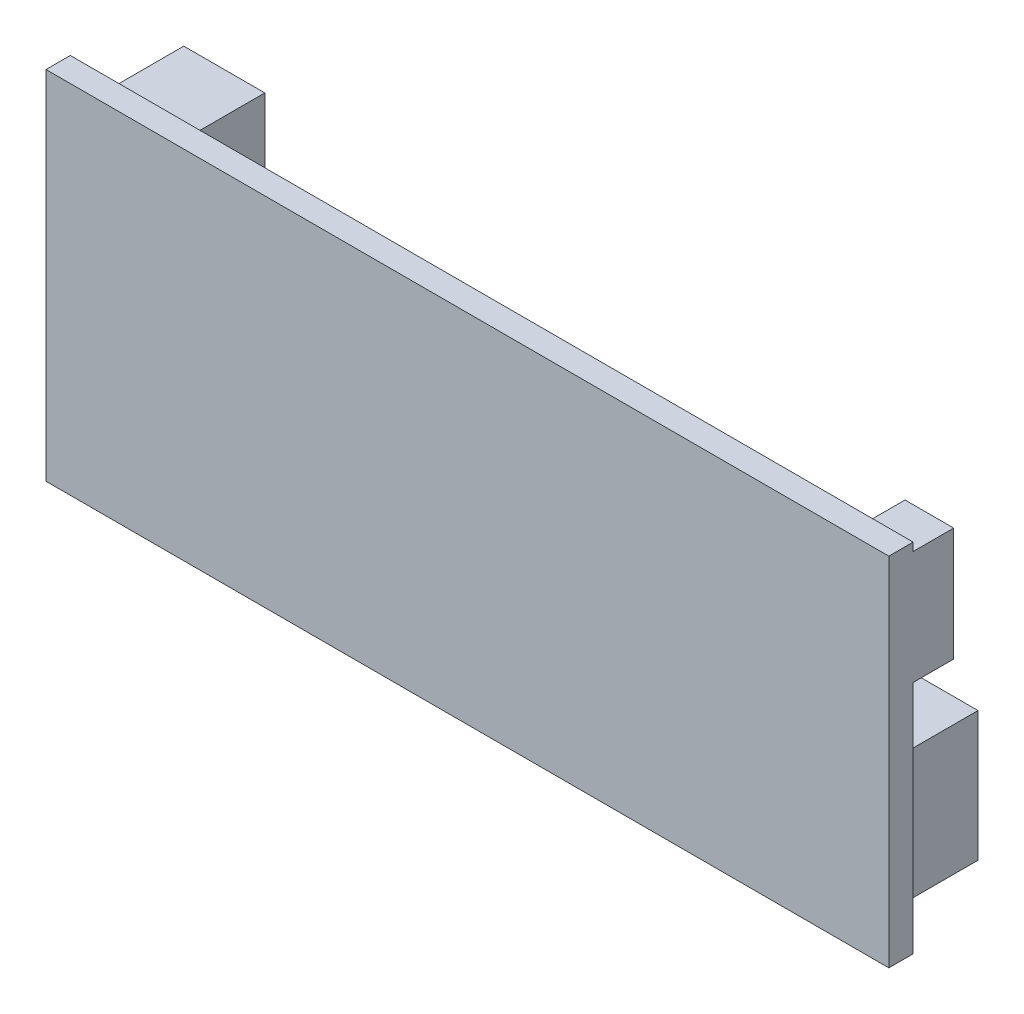
ISO-10303-21;
HEADER;
FILE_DESCRIPTION(('STEP AP214'),'2;1');
FILE_NAME('part.step','',(''),(''),'','','');
FILE_SCHEMA(('AUTOMOTIVE_DESIGN { 1 0 10303 214 1 1 1 1 }'));
ENDSEC;
DATA;
#1=APPLICATION_CONTEXT('core data for automotive mechanical design processes');
#2=APPLICATION_PROTOCOL_DEFINITION('international standard','automotive_design',2000,#1);
#3=PRODUCT_CONTEXT('',#1,'mechanical');
#4=PRODUCT('Part','Part','',(#3));
#5=PRODUCT_RELATED_PRODUCT_CATEGORY('part','',(#4));
#6=PRODUCT_DEFINITION_FORMATION('','',#4);
#7=PRODUCT_DEFINITION_CONTEXT('part definition',#1,'design');
#8=PRODUCT_DEFINITION('design','',#6,#7);
#9=PRODUCT_DEFINITION_SHAPE('','',#8);
#10=(LENGTH_UNIT() NAMED_UNIT(*) SI_UNIT(.MILLI.,.METRE.));
#11=(NAMED_UNIT(*) PLANE_ANGLE_UNIT() SI_UNIT($,.RADIAN.));
#12=(NAMED_UNIT(*) SI_UNIT($,.STERADIAN.) SOLID_ANGLE_UNIT());
#13=UNCERTAINTY_MEASURE_WITH_UNIT(LENGTH_MEASURE(1.E-05),#10,'distance_accuracy_value','');
#14=(GEOMETRIC_REPRESENTATION_CONTEXT(3) GLOBAL_UNCERTAINTY_ASSIGNED_CONTEXT((#13)) GLOBAL_UNIT_ASSIGNED_CONTEXT((#10,
#11,#12)) REPRESENTATION_CONTEXT('',''));
#15=CARTESIAN_POINT('',(0.,0.,0.));
#16=DIRECTION('',(0.,0.,1.));
#17=DIRECTION('',(1.,0.,0.));
#18=AXIS2_PLACEMENT_3D('',#15,#16,#17);
#19=CARTESIAN_POINT('',(0.,0.,0.));
#20=DIRECTION('',(0.,0.,1.));
#21=DIRECTION('',(1.,0.,0.));
#22=AXIS2_PLACEMENT_3D('',#19,#20,#21);
#23=PLANE('',#22);
#24=DIRECTION('',(0.,1.,0.));
#25=VECTOR('',#24,1.);
#26=CARTESIAN_POINT('',(-17.781512605042,20.5,0.));
#27=LINE('',#26,#25);
#28=CARTESIAN_POINT('',(-17.781512605042,15.5,0.));
#29=VERTEX_POINT('',#28);
#30=CARTESIAN_POINT('',(-17.781512605042,20.5,0.));
#31=VERTEX_POINT('',#30);
#32=EDGE_CURVE('E288',#29,#31,#27,.T.);
#33=ORIENTED_EDGE('',*,*,#32,.F.);
#34=DIRECTION('',(-1.,0.,0.));
#35=VECTOR('',#34,1.);
#36=CARTESIAN_POINT('',(-17.781512605042,15.5,0.));
#37=LINE('',#36,#35);
#38=CARTESIAN_POINT('',(-12.781512605042,15.5,0.));
#39=VERTEX_POINT('',#38);
#40=EDGE_CURVE('E178',#39,#29,#37,.T.);
#41=ORIENTED_EDGE('',*,*,#40,.F.);
#42=DIRECTION('',(0.,-1.,0.));
#43=VECTOR('',#42,1.);
#44=CARTESIAN_POINT('',(-12.781512605042,20.5,0.));
#45=LINE('',#44,#43);
#46=CARTESIAN_POINT('',(-12.781512605042,20.5,0.));
#47=VERTEX_POINT('',#46);
#48=EDGE_CURVE('E293',#47,#39,#45,.T.);
#49=ORIENTED_EDGE('',*,*,#48,.F.);
#50=DIRECTION('',(1.,0.,0.));
#51=VECTOR('',#50,1.);
#52=CARTESIAN_POINT('',(-17.781512605042,20.5,0.));
#53=LINE('',#52,#51);
#54=EDGE_CURVE('E290',#31,#47,#53,.T.);
#55=ORIENTED_EDGE('',*,*,#54,.F.);
#56=EDGE_LOOP('',(#33,#41,#49,#55));
#57=FACE_BOUND('',#56,.T.);
#58=DIRECTION('',(0.,-1.,0.));
#59=VECTOR('',#58,1.);
#60=CARTESIAN_POINT('',(31.218487394958,1.5,0.));
#61=LINE('',#60,#59);
#62=CARTESIAN_POINT('',(31.218487394958,9.5,0.));
#63=VERTEX_POINT('',#62);
#64=CARTESIAN_POINT('',(31.218487394958,1.5,0.));
#65=VERTEX_POINT('',#64);
#66=EDGE_CURVE('E264',#63,#65,#61,.T.);
#67=ORIENTED_EDGE('',*,*,#66,.F.);
#68=DIRECTION('',(1.,0.,0.));
#69=VECTOR('',#68,1.);
#70=CARTESIAN_POINT('',(31.218487394958,9.5,0.));
#71=LINE('',#70,#69);
#72=CARTESIAN_POINT('',(21.218487394958,9.5,0.));
#73=VERTEX_POINT('',#72);
#74=EDGE_CURVE('E273',#73,#63,#71,.T.);
#75=ORIENTED_EDGE('',*,*,#74,.F.);
#76=DIRECTION('',(0.,1.,0.));
#77=VECTOR('',#76,1.);
#78=CARTESIAN_POINT('',(21.218487394958,1.5,0.));
#79=LINE('',#78,#77);
#80=CARTESIAN_POINT('',(21.218487394958,1.5,0.));
#81=VERTEX_POINT('',#80);
#82=EDGE_CURVE('E270',#81,#73,#79,.T.);
#83=ORIENTED_EDGE('',*,*,#82,.F.);
#84=DIRECTION('',(-1.,0.,0.));
#85=VECTOR('',#84,1.);
#86=CARTESIAN_POINT('',(31.218487394958,1.5,0.));
#87=LINE('',#86,#85);
#88=EDGE_CURVE('E267',#65,#81,#87,.T.);
#89=ORIENTED_EDGE('',*,*,#88,.F.);
#90=EDGE_LOOP('',(#67,#75,#83,#89));
#91=FACE_BOUND('',#90,.T.);
#92=DIRECTION('',(-1.,0.,0.));
#93=VECTOR('',#92,1.);
#94=CARTESIAN_POINT('',(-17.781512605042,3.09786204051446,0.));
#95=LINE('',#94,#93);
#96=CARTESIAN_POINT('',(-17.781512605042,3.09786204051446,0.));
#97=VERTEX_POINT('',#96);
#98=CARTESIAN_POINT('',(-19.281512605042,3.09786204051446,0.));
#99=VERTEX_POINT('',#98);
#100=EDGE_CURVE('E228',#97,#99,#95,.T.);
#101=ORIENTED_EDGE('',*,*,#100,.F.);
#102=DIRECTION('',(0.,-1.,0.));
#103=VECTOR('',#102,1.);
#104=CARTESIAN_POINT('',(-17.781512605042,7.9,0.));
#105=LINE('',#104,#103);
#106=CARTESIAN_POINT('',(-17.781512605042,7.9,0.));
#107=VERTEX_POINT('',#106);
#108=EDGE_CURVE('E225',#107,#97,#105,.T.);
#109=ORIENTED_EDGE('',*,*,#108,.F.);
#110=DIRECTION('',(1.,0.,0.));
#111=VECTOR('',#110,1.);
#112=CARTESIAN_POINT('',(-17.781512605042,7.9,0.));
#113=LINE('',#112,#111);
#114=CARTESIAN_POINT('',(-19.281512605042,7.9,0.));
#115=VERTEX_POINT('',#114);
#116=EDGE_CURVE('E230',#115,#107,#113,.T.);
#117=ORIENTED_EDGE('',*,*,#116,.F.);
#118=DIRECTION('',(0.,-1.,0.));
#119=VECTOR('',#118,1.);
#120=CARTESIAN_POINT('',(-19.281512605042,22.,0.));
#121=LINE('',#120,#119);
#122=CARTESIAN_POINT('',(-19.281512605042,22.,0.));
#123=VERTEX_POINT('',#122);
#124=EDGE_CURVE('E317',#123,#115,#121,.T.);
#125=ORIENTED_EDGE('',*,*,#124,.F.);
#126=DIRECTION('',(-1.,0.,0.));
#127=VECTOR('',#126,1.);
#128=CARTESIAN_POINT('',(32.718487394958,22.,0.));
#129=LINE('',#128,#127);
#130=CARTESIAN_POINT('',(32.718487394958,22.,0.));
#131=VERTEX_POINT('',#130);
#132=EDGE_CURVE('E302',#131,#123,#129,.T.);
#133=ORIENTED_EDGE('',*,*,#132,.F.);
#134=DIRECTION('',(0.,1.,0.));
#135=VECTOR('',#134,1.);
#136=CARTESIAN_POINT('',(32.718487394958,0.,0.));
#137=LINE('',#136,#135);
#138=CARTESIAN_POINT('',(32.718487394958,21.5,0.));
#139=VERTEX_POINT('',#138);
#140=EDGE_CURVE('E322',#139,#131,#137,.T.);
#141=ORIENTED_EDGE('',*,*,#140,.F.);
#142=DIRECTION('',(1.,0.,0.));
#143=VECTOR('',#142,1.);
#144=CARTESIAN_POINT('',(32.718487394958,21.5,0.));
#145=LINE('',#144,#143);
#146=CARTESIAN_POINT('',(29.718487394958,21.5,0.));
#147=VERTEX_POINT('',#146);
#148=EDGE_CURVE('E245',#147,#139,#145,.T.);
#149=ORIENTED_EDGE('',*,*,#148,.F.);
#150=DIRECTION('',(0.,1.,0.));
#151=VECTOR('',#150,1.);
#152=CARTESIAN_POINT('',(29.718487394958,21.5,0.));
#153=LINE('',#152,#151);
#154=CARTESIAN_POINT('',(29.718487394958,14.5,0.));
#155=VERTEX_POINT('',#154);
#156=EDGE_CURVE('E252',#155,#147,#153,.T.);
#157=ORIENTED_EDGE('',*,*,#156,.F.);
#158=DIRECTION('',(-1.,0.,0.));
#159=VECTOR('',#158,1.);
#160=CARTESIAN_POINT('',(32.718487394958,14.5,0.));
#161=LINE('',#160,#159);
#162=CARTESIAN_POINT('',(32.718487394958,14.5,0.));
#163=VERTEX_POINT('',#162);
#164=EDGE_CURVE('E240',#163,#155,#161,.T.);
#165=ORIENTED_EDGE('',*,*,#164,.F.);
#166=CARTESIAN_POINT('',(32.718487394958,0.,0.));
#167=VERTEX_POINT('',#166);
#168=EDGE_CURVE('E307',#167,#163,#137,.T.);
#169=ORIENTED_EDGE('',*,*,#168,.F.);
#170=DIRECTION('',(1.,0.,0.));
#171=VECTOR('',#170,1.);
#172=CARTESIAN_POINT('',(-19.281512605042,0.,0.));
#173=LINE('',#172,#171);
#174=CARTESIAN_POINT('',(-19.281512605042,0.,0.));
#175=VERTEX_POINT('',#174);
#176=EDGE_CURVE('E320',#175,#167,#173,.T.);
#177=ORIENTED_EDGE('',*,*,#176,.F.);
#178=EDGE_CURVE('E316',#99,#175,#121,.T.);
#179=ORIENTED_EDGE('',*,*,#178,.F.);
#180=EDGE_LOOP('',(#101,#109,#117,#125,#133,#141,#149,#157,#165,#169,#177,#179));
#181=FACE_BOUND('',#180,.T.);
#182=ADVANCED_FACE('F33',(#57,#91,#181),#23,.F.);
#183=CARTESIAN_POINT('',(32.718487394958,22.,1.5));
#184=DIRECTION('',(0.,-1.,0.));
#185=DIRECTION('',(0.,0.,-1.));
#186=AXIS2_PLACEMENT_3D('',#183,#184,#185);
#187=PLANE('',#186);
#188=ORIENTED_EDGE('',*,*,#132,.T.);
#189=DIRECTION('',(0.,0.,-1.));
#190=VECTOR('',#189,1.);
#191=CARTESIAN_POINT('',(-19.281512605042,22.,1.5));
#192=LINE('',#191,#190);
#193=CARTESIAN_POINT('',(-19.281512605042,22.,1.5));
#194=VERTEX_POINT('',#193);
#195=EDGE_CURVE('E11',#194,#123,#192,.T.);
#196=ORIENTED_EDGE('',*,*,#195,.F.);
#197=DIRECTION('',(-1.,0.,0.));
#198=VECTOR('',#197,1.);
#199=CARTESIAN_POINT('',(32.718487394958,22.,1.5));
#200=LINE('',#199,#198);
#201=CARTESIAN_POINT('',(32.718487394958,22.,1.5));
#202=VERTEX_POINT('',#201);
#203=EDGE_CURVE('E303',#202,#194,#200,.T.);
#204=ORIENTED_EDGE('',*,*,#203,.F.);
#205=DIRECTION('',(0.,0.,-1.));
#206=VECTOR('',#205,1.);
#207=CARTESIAN_POINT('',(32.718487394958,22.,1.5));
#208=LINE('',#207,#206);
#209=EDGE_CURVE('E313',#202,#131,#208,.T.);
#210=ORIENTED_EDGE('',*,*,#209,.T.);
#211=EDGE_LOOP('',(#188,#196,#204,#210));
#212=FACE_BOUND('',#211,.T.);
#213=ADVANCED_FACE('F35',(#212),#187,.F.);
#214=CARTESIAN_POINT('',(-19.281512605042,22.,1.5));
#215=DIRECTION('',(1.,0.,0.));
#216=DIRECTION('',(0.,0.,-1.));
#217=AXIS2_PLACEMENT_3D('',#214,#215,#216);
#218=PLANE('',#217);
#219=ORIENTED_EDGE('',*,*,#124,.T.);
#220=DIRECTION('',(0.,0.,1.));
#221=VECTOR('',#220,1.);
#222=CARTESIAN_POINT('',(-19.281512605042,7.9,-2.5));
#223=LINE('',#222,#221);
#224=CARTESIAN_POINT('',(-19.281512605042,7.9,-5.5));
#225=VERTEX_POINT('',#224);
#226=EDGE_CURVE('E235',#225,#115,#223,.T.);
#227=ORIENTED_EDGE('',*,*,#226,.F.);
#228=DIRECTION('',(0.,1.,0.));
#229=VECTOR('',#228,1.);
#230=CARTESIAN_POINT('',(-19.281512605042,3.09786204051446,-5.5));
#231=LINE('',#230,#229);
#232=CARTESIAN_POINT('',(-19.281512605042,3.09786204051446,-5.5));
#233=VERTEX_POINT('',#232);
#234=EDGE_CURVE('E210',#233,#225,#231,.T.);
#235=ORIENTED_EDGE('',*,*,#234,.F.);
#236=DIRECTION('',(0.,0.,1.));
#237=VECTOR('',#236,1.);
#238=CARTESIAN_POINT('',(-19.281512605042,3.09786204051446,-2.5));
#239=LINE('',#238,#237);
#240=EDGE_CURVE('E48',#233,#99,#239,.T.);
#241=ORIENTED_EDGE('',*,*,#240,.T.);
#242=ORIENTED_EDGE('',*,*,#178,.T.);
#243=DIRECTION('',(0.,0.,-1.));
#244=VECTOR('',#243,1.);
#245=CARTESIAN_POINT('',(-19.281512605042,0.,1.5));
#246=LINE('',#245,#244);
#247=CARTESIAN_POINT('',(-19.281512605042,0.,1.5));
#248=VERTEX_POINT('',#247);
#249=EDGE_CURVE('E41',#248,#175,#246,.T.);
#250=ORIENTED_EDGE('',*,*,#249,.F.);
#251=DIRECTION('',(0.,-1.,0.));
#252=VECTOR('',#251,1.);
#253=CARTESIAN_POINT('',(-19.281512605042,22.,1.5));
#254=LINE('',#253,#252);
#255=EDGE_CURVE('E306',#194,#248,#254,.T.);
#256=ORIENTED_EDGE('',*,*,#255,.F.);
#257=ORIENTED_EDGE('',*,*,#195,.T.);
#258=EDGE_LOOP('',(#219,#227,#235,#241,#242,#250,#256,#257));
#259=FACE_BOUND('',#258,.T.);
#260=ADVANCED_FACE('F350',(#259),#218,.F.);
#261=CARTESIAN_POINT('',(-19.281512605042,0.,1.5));
#262=DIRECTION('',(0.,1.,0.));
#263=DIRECTION('',(0.,0.,1.));
#264=AXIS2_PLACEMENT_3D('',#261,#262,#263);
#265=PLANE('',#264);
#266=ORIENTED_EDGE('',*,*,#176,.T.);
#267=DIRECTION('',(0.,0.,-1.));
#268=VECTOR('',#267,1.);
#269=CARTESIAN_POINT('',(32.718487394958,0.,1.5));
#270=LINE('',#269,#268);
#271=CARTESIAN_POINT('',(32.718487394958,0.,1.5));
#272=VERTEX_POINT('',#271);
#273=EDGE_CURVE('E327',#272,#167,#270,.T.);
#274=ORIENTED_EDGE('',*,*,#273,.F.);
#275=DIRECTION('',(1.,0.,0.));
#276=VECTOR('',#275,1.);
#277=CARTESIAN_POINT('',(-19.281512605042,0.,1.5));
#278=LINE('',#277,#276);
#279=EDGE_CURVE('E309',#248,#272,#278,.T.);
#280=ORIENTED_EDGE('',*,*,#279,.F.);
#281=ORIENTED_EDGE('',*,*,#249,.T.);
#282=EDGE_LOOP('',(#266,#274,#280,#281));
#283=FACE_BOUND('',#282,.T.);
#284=ADVANCED_FACE('F334',(#283),#265,.F.);
#285=CARTESIAN_POINT('',(32.718487394958,0.,1.5));
#286=DIRECTION('',(-1.,0.,0.));
#287=DIRECTION('',(0.,-1.,0.));
#288=AXIS2_PLACEMENT_3D('',#285,#286,#287);
#289=PLANE('',#288);
#290=ORIENTED_EDGE('',*,*,#168,.T.);
#291=DIRECTION('',(0.,0.,1.));
#292=VECTOR('',#291,1.);
#293=CARTESIAN_POINT('',(32.718487394958,14.5,-2.5));
#294=LINE('',#293,#292);
#295=CARTESIAN_POINT('',(32.718487394958,14.5,-2.5));
#296=VERTEX_POINT('',#295);
#297=EDGE_CURVE('E262',#296,#163,#294,.T.);
#298=ORIENTED_EDGE('',*,*,#297,.F.);
#299=DIRECTION('',(0.,-1.,0.));
#300=VECTOR('',#299,1.);
#301=CARTESIAN_POINT('',(32.718487394958,21.5,-2.5));
#302=LINE('',#301,#300);
#303=CARTESIAN_POINT('',(32.718487394958,21.5,-2.5));
#304=VERTEX_POINT('',#303);
#305=EDGE_CURVE('E241',#304,#296,#302,.T.);
#306=ORIENTED_EDGE('',*,*,#305,.F.);
#307=DIRECTION('',(0.,0.,1.));
#308=VECTOR('',#307,1.);
#309=CARTESIAN_POINT('',(32.718487394958,21.5,-2.5));
#310=LINE('',#309,#308);
#311=EDGE_CURVE('E56',#304,#139,#310,.T.);
#312=ORIENTED_EDGE('',*,*,#311,.T.);
#313=ORIENTED_EDGE('',*,*,#140,.T.);
#314=ORIENTED_EDGE('',*,*,#209,.F.);
#315=DIRECTION('',(0.,1.,0.));
#316=VECTOR('',#315,1.);
#317=CARTESIAN_POINT('',(32.718487394958,0.,1.5));
#318=LINE('',#317,#316);
#319=EDGE_CURVE('E311',#272,#202,#318,.T.);
#320=ORIENTED_EDGE('',*,*,#319,.F.);
#321=ORIENTED_EDGE('',*,*,#273,.T.);
#322=EDGE_LOOP('',(#290,#298,#306,#312,#313,#314,#320,#321));
#323=FACE_BOUND('',#322,.T.);
#324=ADVANCED_FACE('F343',(#323),#289,.F.);
#325=CARTESIAN_POINT('',(0.,0.,1.5));
#326=DIRECTION('',(0.,0.,1.));
#327=DIRECTION('',(1.,0.,0.));
#328=AXIS2_PLACEMENT_3D('',#325,#326,#327);
#329=PLANE('',#328);
#330=ORIENTED_EDGE('',*,*,#203,.T.);
#331=ORIENTED_EDGE('',*,*,#255,.T.);
#332=ORIENTED_EDGE('',*,*,#279,.T.);
#333=ORIENTED_EDGE('',*,*,#319,.T.);
#334=EDGE_LOOP('',(#330,#331,#332,#333));
#335=FACE_BOUND('',#334,.T.);
#336=ADVANCED_FACE('F348',(#335),#329,.T.);
#337=CARTESIAN_POINT('',(-17.781512605042,20.5,-2.5));
#338=DIRECTION('',(1.,0.,0.));
#339=DIRECTION('',(0.,0.,-1.));
#340=AXIS2_PLACEMENT_3D('',#337,#338,#339);
#341=PLANE('',#340);
#342=ORIENTED_EDGE('',*,*,#32,.T.);
#343=DIRECTION('',(0.,0.,1.));
#344=VECTOR('',#343,1.);
#345=CARTESIAN_POINT('',(-17.781512605042,20.5,-2.5));
#346=LINE('',#345,#344);
#347=CARTESIAN_POINT('',(-17.781512605042,20.5,-5.5));
#348=VERTEX_POINT('',#347);
#349=EDGE_CURVE('E187',#348,#31,#346,.T.);
#350=ORIENTED_EDGE('',*,*,#349,.F.);
#351=DIRECTION('',(0.,1.,0.));
#352=VECTOR('',#351,1.);
#353=CARTESIAN_POINT('',(-17.781512605042,15.5,-5.5));
#354=LINE('',#353,#352);
#355=CARTESIAN_POINT('',(-17.781512605042,15.5,-5.5));
#356=VERTEX_POINT('',#355);
#357=EDGE_CURVE('E184',#356,#348,#354,.T.);
#358=ORIENTED_EDGE('',*,*,#357,.F.);
#359=DIRECTION('',(0.,0.,1.));
#360=VECTOR('',#359,1.);
#361=CARTESIAN_POINT('',(-17.781512605042,15.5,-2.5));
#362=LINE('',#361,#360);
#363=EDGE_CURVE('E172',#356,#29,#362,.T.);
#364=ORIENTED_EDGE('',*,*,#363,.T.);
#365=EDGE_LOOP('',(#342,#350,#358,#364));
#366=FACE_BOUND('',#365,.T.);
#367=ADVANCED_FACE('F185',(#366),#341,.F.);
#368=CARTESIAN_POINT('',(-17.781512605042,20.5,-2.5));
#369=DIRECTION('',(0.,-1.,0.));
#370=DIRECTION('',(0.,0.,-1.));
#371=AXIS2_PLACEMENT_3D('',#368,#369,#370);
#372=PLANE('',#371);
#373=ORIENTED_EDGE('',*,*,#54,.T.);
#374=DIRECTION('',(0.,0.,1.));
#375=VECTOR('',#374,1.);
#376=CARTESIAN_POINT('',(-12.781512605042,20.5,-2.5));
#377=LINE('',#376,#375);
#378=CARTESIAN_POINT('',(-12.781512605042,20.5,-5.5));
#379=VERTEX_POINT('',#378);
#380=EDGE_CURVE('E298',#379,#47,#377,.T.);
#381=ORIENTED_EDGE('',*,*,#380,.F.);
#382=DIRECTION('',(1.,0.,0.));
#383=VECTOR('',#382,1.);
#384=CARTESIAN_POINT('',(-17.781512605042,20.5,-5.5));
#385=LINE('',#384,#383);
#386=EDGE_CURVE('E191',#348,#379,#385,.T.);
#387=ORIENTED_EDGE('',*,*,#386,.F.);
#388=ORIENTED_EDGE('',*,*,#349,.T.);
#389=EDGE_LOOP('',(#373,#381,#387,#388));
#390=FACE_BOUND('',#389,.T.);
#391=ADVANCED_FACE('F417',(#390),#372,.F.);
#392=CARTESIAN_POINT('',(-12.781512605042,20.5,-2.5));
#393=DIRECTION('',(-1.,0.,0.));
#394=DIRECTION('',(0.,0.,1.));
#395=AXIS2_PLACEMENT_3D('',#392,#393,#394);
#396=PLANE('',#395);
#397=ORIENTED_EDGE('',*,*,#48,.T.);
#398=DIRECTION('',(0.,0.,1.));
#399=VECTOR('',#398,1.);
#400=CARTESIAN_POINT('',(-12.781512605042,15.5,-2.5));
#401=LINE('',#400,#399);
#402=CARTESIAN_POINT('',(-12.781512605042,15.5,-5.5));
#403=VERTEX_POINT('',#402);
#404=EDGE_CURVE('E181',#403,#39,#401,.T.);
#405=ORIENTED_EDGE('',*,*,#404,.F.);
#406=DIRECTION('',(0.,-1.,0.));
#407=VECTOR('',#406,1.);
#408=CARTESIAN_POINT('',(-12.781512605042,20.5,-5.5));
#409=LINE('',#408,#407);
#410=EDGE_CURVE('E196',#379,#403,#409,.T.);
#411=ORIENTED_EDGE('',*,*,#410,.F.);
#412=ORIENTED_EDGE('',*,*,#380,.T.);
#413=EDGE_LOOP('',(#397,#405,#411,#412));
#414=FACE_BOUND('',#413,.T.);
#415=ADVANCED_FACE('F423',(#414),#396,.F.);
#416=CARTESIAN_POINT('',(-17.781512605042,15.5,-2.5));
#417=DIRECTION('',(0.,1.,0.));
#418=DIRECTION('',(0.,0.,1.));
#419=AXIS2_PLACEMENT_3D('',#416,#417,#418);
#420=PLANE('',#419);
#421=ORIENTED_EDGE('',*,*,#40,.T.);
#422=ORIENTED_EDGE('',*,*,#363,.F.);
#423=DIRECTION('',(-1.,0.,0.));
#424=VECTOR('',#423,1.);
#425=CARTESIAN_POINT('',(-12.781512605042,15.5,-5.5));
#426=LINE('',#425,#424);
#427=EDGE_CURVE('E177',#403,#356,#426,.T.);
#428=ORIENTED_EDGE('',*,*,#427,.F.);
#429=ORIENTED_EDGE('',*,*,#404,.T.);
#430=EDGE_LOOP('',(#421,#422,#428,#429));
#431=FACE_BOUND('',#430,.T.);
#432=ADVANCED_FACE('F174',(#431),#420,.F.);
#433=CARTESIAN_POINT('',(31.218487394958,1.5,-2.5));
#434=DIRECTION('',(-1.,0.,0.));
#435=DIRECTION('',(0.,0.,1.));
#436=AXIS2_PLACEMENT_3D('',#433,#434,#435);
#437=PLANE('',#436);
#438=ORIENTED_EDGE('',*,*,#66,.T.);
#439=DIRECTION('',(0.,0.,1.));
#440=VECTOR('',#439,1.);
#441=CARTESIAN_POINT('',(31.218487394958,1.5,-2.5));
#442=LINE('',#441,#440);
#443=CARTESIAN_POINT('',(31.218487394958,1.5,-5.5));
#444=VERTEX_POINT('',#443);
#445=EDGE_CURVE('E285',#444,#65,#442,.T.);
#446=ORIENTED_EDGE('',*,*,#445,.F.);
#447=DIRECTION('',(0.,-1.,0.));
#448=VECTOR('',#447,1.);
#449=CARTESIAN_POINT('',(31.218487394958,9.5,-5.5));
#450=LINE('',#449,#448);
#451=CARTESIAN_POINT('',(31.218487394958,9.5,-5.5));
#452=VERTEX_POINT('',#451);
#453=EDGE_CURVE('E216',#452,#444,#450,.T.);
#454=ORIENTED_EDGE('',*,*,#453,.F.);
#455=DIRECTION('',(0.,0.,1.));
#456=VECTOR('',#455,1.);
#457=CARTESIAN_POINT('',(31.218487394958,9.5,-2.5));
#458=LINE('',#457,#456);
#459=EDGE_CURVE('E276',#452,#63,#458,.T.);
#460=ORIENTED_EDGE('',*,*,#459,.T.);
#461=EDGE_LOOP('',(#438,#446,#454,#460));
#462=FACE_BOUND('',#461,.T.);
#463=ADVANCED_FACE('F438',(#462),#437,.F.);
#464=CARTESIAN_POINT('',(31.218487394958,1.5,-2.5));
#465=DIRECTION('',(0.,1.,0.));
#466=DIRECTION('',(0.,0.,1.));
#467=AXIS2_PLACEMENT_3D('',#464,#465,#466);
#468=PLANE('',#467);
#469=ORIENTED_EDGE('',*,*,#88,.T.);
#470=DIRECTION('',(0.,0.,1.));
#471=VECTOR('',#470,1.);
#472=CARTESIAN_POINT('',(21.218487394958,1.5,-2.5));
#473=LINE('',#472,#471);
#474=CARTESIAN_POINT('',(21.218487394958,1.5,-5.5));
#475=VERTEX_POINT('',#474);
#476=EDGE_CURVE('E282',#475,#81,#473,.T.);
#477=ORIENTED_EDGE('',*,*,#476,.F.);
#478=DIRECTION('',(-1.,0.,0.));
#479=VECTOR('',#478,1.);
#480=CARTESIAN_POINT('',(31.218487394958,1.5,-5.5));
#481=LINE('',#480,#479);
#482=EDGE_CURVE('E219',#444,#475,#481,.T.);
#483=ORIENTED_EDGE('',*,*,#482,.F.);
#484=ORIENTED_EDGE('',*,*,#445,.T.);
#485=EDGE_LOOP('',(#469,#477,#483,#484));
#486=FACE_BOUND('',#485,.T.);
#487=ADVANCED_FACE('F445',(#486),#468,.F.);
#488=CARTESIAN_POINT('',(21.218487394958,1.5,-2.5));
#489=DIRECTION('',(1.,0.,0.));
#490=DIRECTION('',(0.,0.,-1.));
#491=AXIS2_PLACEMENT_3D('',#488,#489,#490);
#492=PLANE('',#491);
#493=ORIENTED_EDGE('',*,*,#82,.T.);
#494=DIRECTION('',(0.,0.,1.));
#495=VECTOR('',#494,1.);
#496=CARTESIAN_POINT('',(21.218487394958,9.5,-2.5));
#497=LINE('',#496,#495);
#498=CARTESIAN_POINT('',(21.218487394958,9.5,-5.5));
#499=VERTEX_POINT('',#498);
#500=EDGE_CURVE('E279',#499,#73,#497,.T.);
#501=ORIENTED_EDGE('',*,*,#500,.F.);
#502=DIRECTION('',(0.,1.,0.));
#503=VECTOR('',#502,1.);
#504=CARTESIAN_POINT('',(21.218487394958,1.5,-5.5));
#505=LINE('',#504,#503);
#506=EDGE_CURVE('E222',#475,#499,#505,.T.);
#507=ORIENTED_EDGE('',*,*,#506,.F.);
#508=ORIENTED_EDGE('',*,*,#476,.T.);
#509=EDGE_LOOP('',(#493,#501,#507,#508));
#510=FACE_BOUND('',#509,.T.);
#511=ADVANCED_FACE('F453',(#510),#492,.F.);
#512=CARTESIAN_POINT('',(31.218487394958,9.5,-2.5));
#513=DIRECTION('',(0.,-1.,0.));
#514=DIRECTION('',(0.,0.,-1.));
#515=AXIS2_PLACEMENT_3D('',#512,#513,#514);
#516=PLANE('',#515);
#517=ORIENTED_EDGE('',*,*,#74,.T.);
#518=ORIENTED_EDGE('',*,*,#459,.F.);
#519=DIRECTION('',(1.,0.,0.));
#520=VECTOR('',#519,1.);
#521=CARTESIAN_POINT('',(21.218487394958,9.5,-5.5));
#522=LINE('',#521,#520);
#523=EDGE_CURVE('E213',#499,#452,#522,.T.);
#524=ORIENTED_EDGE('',*,*,#523,.F.);
#525=ORIENTED_EDGE('',*,*,#500,.T.);
#526=EDGE_LOOP('',(#517,#518,#524,#525));
#527=FACE_BOUND('',#526,.T.);
#528=ADVANCED_FACE('F461',(#527),#516,.F.);
#529=CARTESIAN_POINT('',(32.718487394958,14.5,-2.5));
#530=DIRECTION('',(0.,1.,0.));
#531=DIRECTION('',(0.,0.,1.));
#532=AXIS2_PLACEMENT_3D('',#529,#530,#531);
#533=PLANE('',#532);
#534=ORIENTED_EDGE('',*,*,#164,.T.);
#535=DIRECTION('',(0.,0.,1.));
#536=VECTOR('',#535,1.);
#537=CARTESIAN_POINT('',(29.718487394958,14.5,-2.5));
#538=LINE('',#537,#536);
#539=CARTESIAN_POINT('',(29.718487394958,14.5,-2.5));
#540=VERTEX_POINT('',#539);
#541=EDGE_CURVE('E259',#540,#155,#538,.T.);
#542=ORIENTED_EDGE('',*,*,#541,.F.);
#543=DIRECTION('',(-1.,0.,0.));
#544=VECTOR('',#543,1.);
#545=CARTESIAN_POINT('',(32.718487394958,14.5,-2.5));
#546=LINE('',#545,#544);
#547=EDGE_CURVE('E244',#296,#540,#546,.T.);
#548=ORIENTED_EDGE('',*,*,#547,.F.);
#549=ORIENTED_EDGE('',*,*,#297,.T.);
#550=EDGE_LOOP('',(#534,#542,#548,#549));
#551=FACE_BOUND('',#550,.T.);
#552=ADVANCED_FACE('F469',(#551),#533,.F.);
#553=CARTESIAN_POINT('',(29.718487394958,21.5,-2.5));
#554=DIRECTION('',(1.,0.,0.));
#555=DIRECTION('',(0.,0.,-1.));
#556=AXIS2_PLACEMENT_3D('',#553,#554,#555);
#557=PLANE('',#556);
#558=ORIENTED_EDGE('',*,*,#156,.T.);
#559=DIRECTION('',(0.,0.,1.));
#560=VECTOR('',#559,1.);
#561=CARTESIAN_POINT('',(29.718487394958,21.5,-2.5));
#562=LINE('',#561,#560);
#563=CARTESIAN_POINT('',(29.718487394958,21.5,-2.5));
#564=VERTEX_POINT('',#563);
#565=EDGE_CURVE('E256',#564,#147,#562,.T.);
#566=ORIENTED_EDGE('',*,*,#565,.F.);
#567=DIRECTION('',(0.,1.,0.));
#568=VECTOR('',#567,1.);
#569=CARTESIAN_POINT('',(29.718487394958,21.5,-2.5));
#570=LINE('',#569,#568);
#571=EDGE_CURVE('E247',#540,#564,#570,.T.);
#572=ORIENTED_EDGE('',*,*,#571,.F.);
#573=ORIENTED_EDGE('',*,*,#541,.T.);
#574=EDGE_LOOP('',(#558,#566,#572,#573));
#575=FACE_BOUND('',#574,.T.);
#576=ADVANCED_FACE('F477',(#575),#557,.F.);
#577=CARTESIAN_POINT('',(32.718487394958,21.5,-2.5));
#578=DIRECTION('',(0.,-1.,0.));
#579=DIRECTION('',(0.,0.,-1.));
#580=AXIS2_PLACEMENT_3D('',#577,#578,#579);
#581=PLANE('',#580);
#582=ORIENTED_EDGE('',*,*,#148,.T.);
#583=ORIENTED_EDGE('',*,*,#311,.F.);
#584=DIRECTION('',(1.,0.,0.));
#585=VECTOR('',#584,1.);
#586=CARTESIAN_POINT('',(32.718487394958,21.5,-2.5));
#587=LINE('',#586,#585);
#588=EDGE_CURVE('E249',#564,#304,#587,.T.);
#589=ORIENTED_EDGE('',*,*,#588,.F.);
#590=ORIENTED_EDGE('',*,*,#565,.T.);
#591=EDGE_LOOP('',(#582,#583,#589,#590));
#592=FACE_BOUND('',#591,.T.);
#593=ADVANCED_FACE('F485',(#592),#581,.F.);
#594=CARTESIAN_POINT('',(0.,0.,-2.5));
#595=DIRECTION('',(0.,0.,-1.));
#596=DIRECTION('',(-1.,0.,0.));
#597=AXIS2_PLACEMENT_3D('',#594,#595,#596);
#598=PLANE('',#597);
#599=ORIENTED_EDGE('',*,*,#305,.T.);
#600=ORIENTED_EDGE('',*,*,#547,.T.);
#601=ORIENTED_EDGE('',*,*,#571,.T.);
#602=ORIENTED_EDGE('',*,*,#588,.T.);
#603=EDGE_LOOP('',(#599,#600,#601,#602));
#604=FACE_BOUND('',#603,.T.);
#605=ADVANCED_FACE('F376',(#604),#598,.T.);
#606=CARTESIAN_POINT('',(-17.781512605042,7.9,-2.5));
#607=DIRECTION('',(-1.,0.,0.));
#608=DIRECTION('',(0.,0.,1.));
#609=AXIS2_PLACEMENT_3D('',#606,#607,#608);
#610=PLANE('',#609);
#611=ORIENTED_EDGE('',*,*,#108,.T.);
#612=DIRECTION('',(0.,0.,1.));
#613=VECTOR('',#612,1.);
#614=CARTESIAN_POINT('',(-17.781512605042,3.09786204051446,-2.5));
#615=LINE('',#614,#613);
#616=CARTESIAN_POINT('',(-17.781512605042,3.09786204051446,-5.5));
#617=VERTEX_POINT('',#616);
#618=EDGE_CURVE('E238',#617,#97,#615,.T.);
#619=ORIENTED_EDGE('',*,*,#618,.F.);
#620=DIRECTION('',(0.,-1.,0.));
#621=VECTOR('',#620,1.);
#622=CARTESIAN_POINT('',(-17.781512605042,7.9,-5.5));
#623=LINE('',#622,#621);
#624=CARTESIAN_POINT('',(-17.781512605042,7.9,-5.5));
#625=VERTEX_POINT('',#624);
#626=EDGE_CURVE('E204',#625,#617,#623,.T.);
#627=ORIENTED_EDGE('',*,*,#626,.F.);
#628=DIRECTION('',(0.,0.,1.));
#629=VECTOR('',#628,1.);
#630=CARTESIAN_POINT('',(-17.781512605042,7.9,-2.5));
#631=LINE('',#630,#629);
#632=EDGE_CURVE('E232',#625,#107,#631,.T.);
#633=ORIENTED_EDGE('',*,*,#632,.T.);
#634=EDGE_LOOP('',(#611,#619,#627,#633));
#635=FACE_BOUND('',#634,.T.);
#636=ADVANCED_FACE('F362',(#635),#610,.F.);
#637=CARTESIAN_POINT('',(-17.781512605042,3.09786204051446,-2.5));
#638=DIRECTION('',(0.,1.,0.));
#639=DIRECTION('',(0.,0.,1.));
#640=AXIS2_PLACEMENT_3D('',#637,#638,#639);
#641=PLANE('',#640);
#642=ORIENTED_EDGE('',*,*,#100,.T.);
#643=ORIENTED_EDGE('',*,*,#240,.F.);
#644=DIRECTION('',(-1.,0.,0.));
#645=VECTOR('',#644,1.);
#646=CARTESIAN_POINT('',(-17.781512605042,3.09786204051446,-5.5));
#647=LINE('',#646,#645);
#648=EDGE_CURVE('E207',#617,#233,#647,.T.);
#649=ORIENTED_EDGE('',*,*,#648,.F.);
#650=ORIENTED_EDGE('',*,*,#618,.T.);
#651=EDGE_LOOP('',(#642,#643,#649,#650));
#652=FACE_BOUND('',#651,.T.);
#653=ADVANCED_FACE('F367',(#652),#641,.F.);
#654=CARTESIAN_POINT('',(-17.781512605042,7.9,-2.5));
#655=DIRECTION('',(0.,-1.,0.));
#656=DIRECTION('',(0.,0.,-1.));
#657=AXIS2_PLACEMENT_3D('',#654,#655,#656);
#658=PLANE('',#657);
#659=ORIENTED_EDGE('',*,*,#116,.T.);
#660=ORIENTED_EDGE('',*,*,#632,.F.);
#661=DIRECTION('',(1.,0.,0.));
#662=VECTOR('',#661,1.);
#663=CARTESIAN_POINT('',(-19.281512605042,7.9,-5.5));
#664=LINE('',#663,#662);
#665=EDGE_CURVE('E201',#225,#625,#664,.T.);
#666=ORIENTED_EDGE('',*,*,#665,.F.);
#667=ORIENTED_EDGE('',*,*,#226,.T.);
#668=EDGE_LOOP('',(#659,#660,#666,#667));
#669=FACE_BOUND('',#668,.T.);
#670=ADVANCED_FACE('F358',(#669),#658,.F.);
#671=CARTESIAN_POINT('',(0.,0.,-5.5));
#672=DIRECTION('',(0.,0.,-1.));
#673=DIRECTION('',(-1.,0.,0.));
#674=AXIS2_PLACEMENT_3D('',#671,#672,#673);
#675=PLANE('',#674);
#676=ORIENTED_EDGE('',*,*,#523,.T.);
#677=ORIENTED_EDGE('',*,*,#453,.T.);
#678=ORIENTED_EDGE('',*,*,#482,.T.);
#679=ORIENTED_EDGE('',*,*,#506,.T.);
#680=EDGE_LOOP('',(#676,#677,#678,#679));
#681=FACE_BOUND('',#680,.T.);
#682=ADVANCED_FACE('F374',(#681),#675,.T.);
#683=CARTESIAN_POINT('',(0.,0.,-5.5));
#684=DIRECTION('',(0.,0.,-1.));
#685=DIRECTION('',(-1.,0.,0.));
#686=AXIS2_PLACEMENT_3D('',#683,#684,#685);
#687=PLANE('',#686);
#688=ORIENTED_EDGE('',*,*,#665,.T.);
#689=ORIENTED_EDGE('',*,*,#626,.T.);
#690=ORIENTED_EDGE('',*,*,#648,.T.);
#691=ORIENTED_EDGE('',*,*,#234,.T.);
#692=EDGE_LOOP('',(#688,#689,#690,#691));
#693=FACE_BOUND('',#692,.T.);
#694=ADVANCED_FACE('F365',(#693),#687,.T.);
#695=CARTESIAN_POINT('',(0.,0.,-5.5));
#696=DIRECTION('',(0.,0.,-1.));
#697=DIRECTION('',(-1.,0.,0.));
#698=AXIS2_PLACEMENT_3D('',#695,#696,#697);
#699=PLANE('',#698);
#700=ORIENTED_EDGE('',*,*,#427,.T.);
#701=ORIENTED_EDGE('',*,*,#357,.T.);
#702=ORIENTED_EDGE('',*,*,#386,.T.);
#703=ORIENTED_EDGE('',*,*,#410,.T.);
#704=EDGE_LOOP('',(#700,#701,#702,#703));
#705=FACE_BOUND('',#704,.T.);
#706=ADVANCED_FACE('F194',(#705),#699,.T.);
#707=CLOSED_SHELL('',(#182,#213,#260,#284,#324,#336,#367,#391,#415,#432,#463,#487,#511,#528,
#552,#576,#593,#605,#636,#653,#670,#682,#694,#706));
#708=MANIFOLD_SOLID_BREP('B2',#707);
#709=ADVANCED_BREP_SHAPE_REPRESENTATION('',(#18,#708),#14);
#710=SHAPE_DEFINITION_REPRESENTATION(#9,#709);
ENDSEC;
END-ISO-10303-21;
